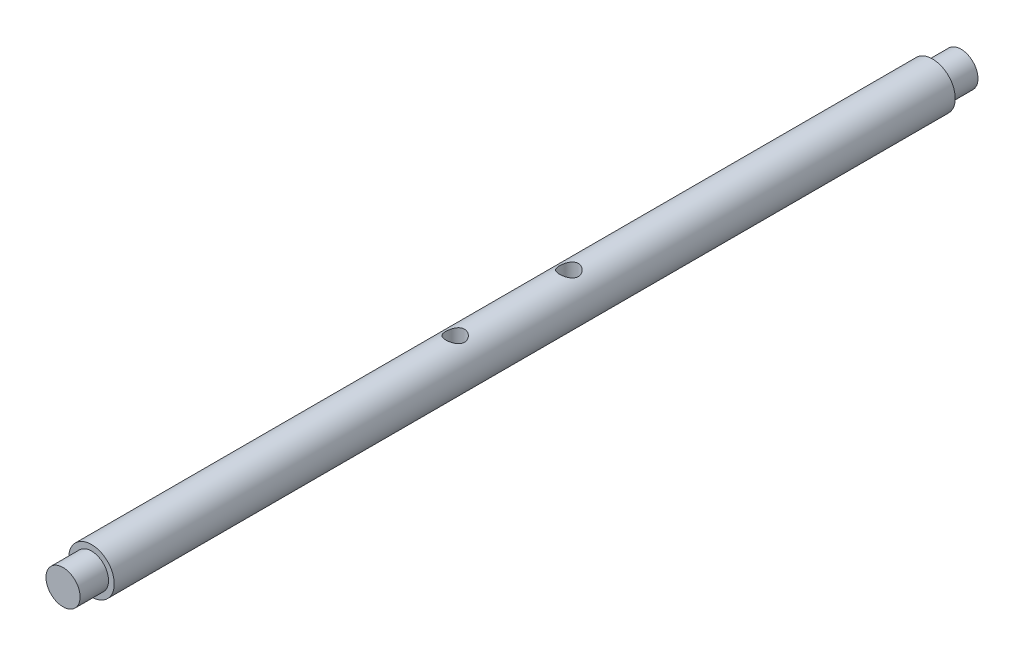
ISO-10303-21;
HEADER;
FILE_DESCRIPTION(('STEP AP214'),'2;1');
FILE_NAME('part.step','',(''),(''),'','','');
FILE_SCHEMA(('AUTOMOTIVE_DESIGN { 1 0 10303 214 1 1 1 1 }'));
ENDSEC;
DATA;
#1=APPLICATION_CONTEXT('core data for automotive mechanical design processes');
#2=APPLICATION_PROTOCOL_DEFINITION('international standard','automotive_design',2000,#1);
#3=PRODUCT_CONTEXT('',#1,'mechanical');
#4=PRODUCT('Part','Part','',(#3));
#5=PRODUCT_RELATED_PRODUCT_CATEGORY('part','',(#4));
#6=PRODUCT_DEFINITION_FORMATION('','',#4);
#7=PRODUCT_DEFINITION_CONTEXT('part definition',#1,'design');
#8=PRODUCT_DEFINITION('design','',#6,#7);
#9=PRODUCT_DEFINITION_SHAPE('','',#8);
#10=(LENGTH_UNIT() NAMED_UNIT(*) SI_UNIT(.MILLI.,.METRE.));
#11=(NAMED_UNIT(*) PLANE_ANGLE_UNIT() SI_UNIT($,.RADIAN.));
#12=(NAMED_UNIT(*) SI_UNIT($,.STERADIAN.) SOLID_ANGLE_UNIT());
#13=UNCERTAINTY_MEASURE_WITH_UNIT(LENGTH_MEASURE(1.E-05),#10,'distance_accuracy_value','');
#14=(GEOMETRIC_REPRESENTATION_CONTEXT(3) GLOBAL_UNCERTAINTY_ASSIGNED_CONTEXT((#13)) GLOBAL_UNIT_ASSIGNED_CONTEXT((#10,
#11,#12)) REPRESENTATION_CONTEXT('',''));
#15=CARTESIAN_POINT('',(0.,0.,0.));
#16=DIRECTION('',(0.,0.,1.));
#17=DIRECTION('',(1.,0.,0.));
#18=AXIS2_PLACEMENT_3D('',#15,#16,#17);
#19=CARTESIAN_POINT('',(0.,0.,147.8));
#20=DIRECTION('',(0.,0.,-1.));
#21=DIRECTION('',(-1.,0.,0.));
#22=AXIS2_PLACEMENT_3D('',#19,#20,#21);
#23=CYLINDRICAL_SURFACE('',#22,4.);
#24=CARTESIAN_POINT('',(0.,-4.,65.55));
#25=CARTESIAN_POINT('',(0.0884596783632864,-3.99999309817074,65.5499907827934));
#26=CARTESIAN_POINT('',(0.177062252057589,-3.99703145792172,65.5428439856567));
#27=CARTESIAN_POINT('',(0.351759669836416,-3.9854711320255,65.5145088580631));
#28=CARTESIAN_POINT('',(0.437847271996969,-3.97685757767606,65.4932834889757));
#29=CARTESIAN_POINT('',(0.604702496902748,-3.95491965529936,65.4377051877981));
#30=CARTESIAN_POINT('',(0.685486934491201,-3.94161112398211,65.4033963566466));
#31=CARTESIAN_POINT('',(0.840076633223493,-3.91158286286531,65.3228052421506));
#32=CARTESIAN_POINT('',(0.913884076117576,-3.89486420463244,65.2765267188299));
#33=CARTESIAN_POINT('',(1.05618769598526,-3.85876900012149,65.170893245356));
#34=CARTESIAN_POINT('',(1.12429373957476,-3.83930654387258,65.111042329751));
#35=CARTESIAN_POINT('',(1.24983574384757,-3.80029483347098,64.9810111603411));
#36=CARTESIAN_POINT('',(1.30726618926958,-3.78074553976622,64.9108256007882));
#37=CARTESIAN_POINT('',(1.4125482680905,-3.74272551686066,64.7580317511283));
#38=CARTESIAN_POINT('',(1.45980781790562,-3.72435159658092,64.6749888846935));
#39=CARTESIAN_POINT('',(1.53951358199408,-3.69212136090386,64.5012636907098));
#40=CARTESIAN_POINT('',(1.57196727712792,-3.67826276509114,64.410585248637));
#41=CARTESIAN_POINT('',(1.61953738222493,-3.65756021871622,64.2286520029982));
#42=CARTESIAN_POINT('',(1.63540371417154,-3.65041449103236,64.137628927857));
#43=CARTESIAN_POINT('',(1.65168918120804,-3.64307714795702,63.9539534926347));
#44=CARTESIAN_POINT('',(1.65211659474001,-3.64288180572738,63.8613020323707));
#45=CARTESIAN_POINT('',(1.63807780779831,-3.64921138579604,63.6844011133813));
#46=CARTESIAN_POINT('',(1.62472398487459,-3.6552343974104,63.6000418412509));
#47=CARTESIAN_POINT('',(1.58536484231199,-3.67247532251837,63.4348897156188));
#48=CARTESIAN_POINT('',(1.55935715587186,-3.68369420783859,63.3540975323967));
#49=CARTESIAN_POINT('',(1.4949241294249,-3.7103145848143,63.1963548912414));
#50=CARTESIAN_POINT('',(1.45624866973018,-3.72579923184191,63.1195212621917));
#51=CARTESIAN_POINT('',(1.36775445443625,-3.75918616236906,62.97313976754));
#52=CARTESIAN_POINT('',(1.3179313547816,-3.77708938726885,62.9035947577509));
#53=CARTESIAN_POINT('',(1.2037191192487,-3.81509742396095,62.7677135922122));
#54=CARTESIAN_POINT('',(1.13846630094389,-3.8352618825369,62.7021180422968));
#55=CARTESIAN_POINT('',(0.997682554866221,-3.87426910607353,62.5825553255586));
#56=CARTESIAN_POINT('',(0.922149319847441,-3.89311157289529,62.5285907761392));
#57=CARTESIAN_POINT('',(0.760736369737334,-3.92787932271737,62.432765226415));
#58=CARTESIAN_POINT('',(0.674664094072245,-3.94373050716791,62.3911997168058));
#59=CARTESIAN_POINT('',(0.495928253552984,-3.97016319816605,62.3233969758911));
#60=CARTESIAN_POINT('',(0.403268287372393,-3.98074755693754,62.2971514467888));
#61=CARTESIAN_POINT('',(0.220181304317681,-3.99492450637935,62.2622704963218));
#62=CARTESIAN_POINT('',(0.12997417230823,-3.99891121146315,62.2526408220641));
#63=CARTESIAN_POINT('',(-0.0508474401522137,-4.00069746426785,62.2483079562367));
#64=CARTESIAN_POINT('',(-0.141461799500558,-3.99849874371343,62.2536005868918));
#65=CARTESIAN_POINT('',(-0.31590775548754,-3.98841747083847,62.278245268243));
#66=CARTESIAN_POINT('',(-0.399855317526676,-3.9808153168881,62.2969040733401));
#67=CARTESIAN_POINT('',(-0.563340473329567,-3.96098887803091,62.3467920963371));
#68=CARTESIAN_POINT('',(-0.642877505872138,-3.94876400644332,62.3780229098148));
#69=CARTESIAN_POINT('',(-0.798061975964468,-3.92039728883464,62.4531893799809));
#70=CARTESIAN_POINT('',(-0.873512656660499,-3.90414585630856,62.4974885617562));
#71=CARTESIAN_POINT('',(-1.01617847320907,-3.86946768187548,62.5971339342579));
#72=CARTESIAN_POINT('',(-1.0833901834211,-3.85104004134398,62.6524846950899));
#73=CARTESIAN_POINT('',(-1.21261994292741,-3.8124029584454,62.777204304812));
#74=CARTESIAN_POINT('',(-1.27394364561821,-3.79215916493832,62.8472838240393));
#75=CARTESIAN_POINT('',(-1.38414835482504,-3.75333928940831,62.9970712906085));
#76=CARTESIAN_POINT('',(-1.43302674162726,-3.73476355904109,63.0767812599426));
#77=CARTESIAN_POINT('',(-1.51742282291386,-3.70128700339843,63.2450953705333));
#78=CARTESIAN_POINT('',(-1.55275802936533,-3.68643724424496,63.3338019160081));
#79=CARTESIAN_POINT('',(-1.60769618165392,-3.66281640168182,63.5167091659782));
#80=CARTESIAN_POINT('',(-1.62731175174752,-3.65404044124936,63.6109053964182));
#81=CARTESIAN_POINT('',(-1.64901123940267,-3.64429559365239,63.7944302731581));
#82=CARTESIAN_POINT('',(-1.65231049364124,-3.64278573581524,63.8835872194579));
#83=CARTESIAN_POINT('',(-1.64451485356566,-3.64631178238904,64.0611284707592));
#84=CARTESIAN_POINT('',(-1.63342206561729,-3.65134672892697,64.1495128869194));
#85=CARTESIAN_POINT('',(-1.59817118006571,-3.666904904187,64.3189330712577));
#86=CARTESIAN_POINT('',(-1.57461958437453,-3.67717261200251,64.4001207114221));
#87=CARTESIAN_POINT('',(-1.51570599472926,-3.70184411206584,64.5574145224741));
#88=CARTESIAN_POINT('',(-1.48034069596891,-3.71624906152171,64.6335192642976));
#89=CARTESIAN_POINT('',(-1.39638062253789,-3.74863408895161,64.7834220382414));
#90=CARTESIAN_POINT('',(-1.3471244359927,-3.76677577854003,64.8568140710214));
#91=CARTESIAN_POINT('',(-1.23771718137822,-3.8041286463671,64.9946716872643));
#92=CARTESIAN_POINT('',(-1.17756245772961,-3.82334018195057,65.0591342627744));
#93=CARTESIAN_POINT('',(-1.04300738755742,-3.86230172013188,65.1819941387037));
#94=CARTESIAN_POINT('',(-0.967900110730158,-3.88199359359226,65.2396392236055));
#95=CARTESIAN_POINT('',(-0.808343463182015,-3.9183242690558,65.3415401595387));
#96=CARTESIAN_POINT('',(-0.723889843442837,-3.9349616732268,65.3857898863659));
#97=CARTESIAN_POINT('',(-0.549414760109621,-3.96305691394126,65.4586637398348));
#98=CARTESIAN_POINT('',(-0.459513381649419,-3.97459855421812,65.4875424253586));
#99=CARTESIAN_POINT('',(-0.275719229213236,-3.99154438775475,65.5295110847852));
#100=CARTESIAN_POINT('',(-0.181839966818023,-3.99696786149576,65.5426506662454));
#101=CARTESIAN_POINT('',(-0.0584442952271896,-3.99968194626838,65.5492267703301));
#102=CARTESIAN_POINT('',(-0.0292299486703303,-4.00000228058838,65.5500030456642));
#103=CARTESIAN_POINT('',(0.,-4.,65.55));
#104=B_SPLINE_CURVE_WITH_KNOTS('',3,(#24,#25,#26,#27,#28,#29,#30,#31,#32,#33,#34,#35,#36,#37,
#38,#39,#40,#41,#42,#43,#44,#45,#46,#47,#48,#49,#50,#51,#52,#53,#54,#55,#56,#57,#58,#59,#60,#61,
#62,#63,#64,#65,#66,#67,#68,#69,#70,#71,#72,#73,#74,#75,#76,#77,#78,#79,#80,#81,#82,#83,#84,#85,
#86,#87,#88,#89,#90,#91,#92,#93,#94,#95,#96,#97,#98,#99,#100,#101,#102,#103),.UNSPECIFIED.,.T.,
.F.,(4,2,2,2,2,2,2,2,2,2,2,2,2,2,2,2,2,2,2,2,2,2,2,2,2,2,2,2,2,2,2,2,2,2,2,2,2,2,2,4),(0.,
0.265297098770617,0.531294937906661,0.796403981498879,1.06142984766523,1.33841878994455,
1.61555043582129,1.90598404924538,2.19627075414926,2.47277648539421,2.74913395037961,
3.00480633611684,3.26052656166861,3.52163539301341,3.78284615202016,4.06565185095456,
4.3485211252851,4.63767392136376,4.92666995726768,5.19768149557686,5.46861716672806,
5.72643264660554,5.98428085748385,6.25011488704507,6.51605907418433,6.80064580250403,
7.08529238632159,7.37364985225781,7.66177550895675,7.92807823226724,8.19434198489785,
8.44869772098561,8.70312467109947,8.9726747998471,9.24231550885214,9.53104085816544,
9.81989801073179,10.1038095613048,10.3868238858899,10.4744866574818),.UNSPECIFIED.);
#105=CARTESIAN_POINT('',(0.,-4.,65.55));
#106=VERTEX_POINT('',#105);
#107=EDGE_CURVE('E10',#106,#106,#104,.T.);
#108=ORIENTED_EDGE('',*,*,#107,.T.);
#109=EDGE_LOOP('',(#108));
#110=FACE_BOUND('',#109,.T.);
#111=CARTESIAN_POINT('',(0.,4.,65.55));
#112=CARTESIAN_POINT('',(-0.0884596783632689,3.99999309817074,65.5499907827934));
#113=CARTESIAN_POINT('',(-0.177062252057572,3.99703145792172,65.5428439856567));
#114=CARTESIAN_POINT('',(-0.351759669836399,3.9854711320255,65.5145088580631));
#115=CARTESIAN_POINT('',(-0.437847271996951,3.97685757767607,65.4932834889757));
#116=CARTESIAN_POINT('',(-0.60470249690273,3.95491965529936,65.4377051877981));
#117=CARTESIAN_POINT('',(-0.685486934491183,3.94161112398211,65.4033963566466));
#118=CARTESIAN_POINT('',(-0.840076633223476,3.91158286286531,65.3228052421506));
#119=CARTESIAN_POINT('',(-0.913884076117558,3.89486420463245,65.2765267188299));
#120=CARTESIAN_POINT('',(-1.05618769598524,3.85876900012149,65.170893245356));
#121=CARTESIAN_POINT('',(-1.12429373957475,3.83930654387259,65.111042329751));
#122=CARTESIAN_POINT('',(-1.24983574384755,3.80029483347099,64.9810111603411));
#123=CARTESIAN_POINT('',(-1.30726618926956,3.78074553976623,64.9108256007882));
#124=CARTESIAN_POINT('',(-1.41254826809049,3.74272551686067,64.7580317511283));
#125=CARTESIAN_POINT('',(-1.4598078179056,3.72435159658093,64.6749888846935));
#126=CARTESIAN_POINT('',(-1.53951358199406,3.69212136090387,64.5012636907098));
#127=CARTESIAN_POINT('',(-1.5719672771279,3.67826276509115,64.410585248637));
#128=CARTESIAN_POINT('',(-1.61953738222491,3.65756021871623,64.2286520029982));
#129=CARTESIAN_POINT('',(-1.63540371417153,3.65041449103237,64.137628927857));
#130=CARTESIAN_POINT('',(-1.65168918120802,3.64307714795703,63.9539534926347));
#131=CARTESIAN_POINT('',(-1.65211659473999,3.64288180572738,63.8613020323707));
#132=CARTESIAN_POINT('',(-1.63807780779829,3.64921138579605,63.6844011133813));
#133=CARTESIAN_POINT('',(-1.62472398487458,3.65523439741041,63.6000418412509));
#134=CARTESIAN_POINT('',(-1.58536484231197,3.67247532251837,63.4348897156188));
#135=CARTESIAN_POINT('',(-1.55935715587184,3.68369420783859,63.3540975323967));
#136=CARTESIAN_POINT('',(-1.49492412942488,3.71031458481431,63.1963548912414));
#137=CARTESIAN_POINT('',(-1.45624866973016,3.72579923184192,63.1195212621917));
#138=CARTESIAN_POINT('',(-1.36775445443624,3.75918616236907,62.97313976754));
#139=CARTESIAN_POINT('',(-1.31793135478158,3.77708938726885,62.9035947577509));
#140=CARTESIAN_POINT('',(-1.20371911924868,3.81509742396095,62.7677135922122));
#141=CARTESIAN_POINT('',(-1.13846630094387,3.8352618825369,62.7021180422968));
#142=CARTESIAN_POINT('',(-0.997682554866204,3.87426910607353,62.5825553255586));
#143=CARTESIAN_POINT('',(-0.922149319847424,3.8931115728953,62.5285907761392));
#144=CARTESIAN_POINT('',(-0.760736369737316,3.92787932271737,62.432765226415));
#145=CARTESIAN_POINT('',(-0.674664094072227,3.94373050716791,62.3911997168058));
#146=CARTESIAN_POINT('',(-0.495928253552967,3.97016319816606,62.3233969758911));
#147=CARTESIAN_POINT('',(-0.403268287372376,3.98074755693754,62.2971514467888));
#148=CARTESIAN_POINT('',(-0.220181304317664,3.99492450637935,62.2622704963218));
#149=CARTESIAN_POINT('',(-0.129974172308213,3.99891121146315,62.2526408220641));
#150=CARTESIAN_POINT('',(0.0508474401522308,4.00069746426785,62.2483079562367));
#151=CARTESIAN_POINT('',(0.141461799500574,3.99849874371343,62.2536005868918));
#152=CARTESIAN_POINT('',(0.315907755487557,3.98841747083846,62.278245268243));
#153=CARTESIAN_POINT('',(0.399855317526693,3.9808153168881,62.2969040733401));
#154=CARTESIAN_POINT('',(0.563340473329583,3.96098887803091,62.3467920963371));
#155=CARTESIAN_POINT('',(0.642877505872155,3.94876400644332,62.3780229098148));
#156=CARTESIAN_POINT('',(0.798061975964484,3.92039728883464,62.4531893799809));
#157=CARTESIAN_POINT('',(0.873512656660517,3.90414585630856,62.4974885617562));
#158=CARTESIAN_POINT('',(1.01617847320908,3.86946768187548,62.5971339342579));
#159=CARTESIAN_POINT('',(1.08339018342112,3.85104004134398,62.6524846950899));
#160=CARTESIAN_POINT('',(1.21261994292742,3.8124029584454,62.777204304812));
#161=CARTESIAN_POINT('',(1.27394364561823,3.79215916493832,62.8472838240393));
#162=CARTESIAN_POINT('',(1.38414835482506,3.7533392894083,62.9970712906085));
#163=CARTESIAN_POINT('',(1.43302674162728,3.73476355904109,63.0767812599426));
#164=CARTESIAN_POINT('',(1.51742282291388,3.70128700339843,63.2450953705333));
#165=CARTESIAN_POINT('',(1.55275802936535,3.68643724424496,63.3338019160081));
#166=CARTESIAN_POINT('',(1.60769618165394,3.66281640168181,63.5167091659782));
#167=CARTESIAN_POINT('',(1.62731175174754,3.65404044124935,63.6109053964182));
#168=CARTESIAN_POINT('',(1.64901123940269,3.64429559365239,63.7944302731581));
#169=CARTESIAN_POINT('',(1.65231049364126,3.64278573581523,63.8835872194579));
#170=CARTESIAN_POINT('',(1.64451485356568,3.64631178238903,64.0611284707592));
#171=CARTESIAN_POINT('',(1.63342206561731,3.65134672892696,64.1495128869194));
#172=CARTESIAN_POINT('',(1.59817118006573,3.66690490418699,64.3189330712577));
#173=CARTESIAN_POINT('',(1.57461958437455,3.6771726120025,64.4001207114221));
#174=CARTESIAN_POINT('',(1.51570599472928,3.70184411206583,64.5574145224741));
#175=CARTESIAN_POINT('',(1.48034069596894,3.7162490615217,64.6335192642976));
#176=CARTESIAN_POINT('',(1.39638062253791,3.7486340889516,64.7834220382414));
#177=CARTESIAN_POINT('',(1.34712443599272,3.76677577854002,64.8568140710214));
#178=CARTESIAN_POINT('',(1.23771718137823,3.80412864636709,64.9946716872643));
#179=CARTESIAN_POINT('',(1.17756245772963,3.82334018195056,65.0591342627744));
#180=CARTESIAN_POINT('',(1.04300738755744,3.86230172013188,65.1819941387037));
#181=CARTESIAN_POINT('',(0.967900110730185,3.88199359359226,65.2396392236056));
#182=CARTESIAN_POINT('',(0.808343463182043,3.91832426905579,65.3415401595387));
#183=CARTESIAN_POINT('',(0.723889843442858,3.9349616732268,65.3857898863659));
#184=CARTESIAN_POINT('',(0.549414760109637,3.96305691394126,65.4586637398347));
#185=CARTESIAN_POINT('',(0.459513381649437,3.97459855421812,65.4875424253586));
#186=CARTESIAN_POINT('',(0.275719229213254,3.99154438775475,65.5295110847852));
#187=CARTESIAN_POINT('',(0.18183996681804,3.99696786149576,65.5426506662454));
#188=CARTESIAN_POINT('',(0.0584442952272064,3.99968194626838,65.5492267703301));
#189=CARTESIAN_POINT('',(0.0292299486703474,4.00000228058838,65.5500030456642));
#190=CARTESIAN_POINT('',(0.,4.,65.55));
#191=B_SPLINE_CURVE_WITH_KNOTS('',3,(#111,#112,#113,#114,#115,#116,#117,#118,#119,#120,#121,
#122,#123,#124,#125,#126,#127,#128,#129,#130,#131,#132,#133,#134,#135,#136,#137,#138,#139,#140,
#141,#142,#143,#144,#145,#146,#147,#148,#149,#150,#151,#152,#153,#154,#155,#156,#157,#158,#159,
#160,#161,#162,#163,#164,#165,#166,#167,#168,#169,#170,#171,#172,#173,#174,#175,#176,#177,#178,
#179,#180,#181,#182,#183,#184,#185,#186,#187,#188,#189,#190),.UNSPECIFIED.,.T.,.F.,(4,2,2,2,2,2,
2,2,2,2,2,2,2,2,2,2,2,2,2,2,2,2,2,2,2,2,2,2,2,2,2,2,2,2,2,2,2,2,2,4),(0.,0.265297098770616,
0.531294937906661,0.796403981498878,1.06142984766523,1.33841878994455,1.61555043582129,
1.90598404924538,2.19627075414925,2.47277648539421,2.7491339503796,3.00480633611684,
3.26052656166861,3.52163539301341,3.78284615202016,4.06565185095456,4.34852112528509,
4.63767392136376,4.92666995726768,5.19768149557686,5.46861716672805,5.72643264660554,
5.98428085748385,6.25011488704507,6.51605907418433,6.80064580250403,7.08529238632159,
7.37364985225781,7.66177550895675,7.92807823226724,8.19434198489785,8.44869772098559,
8.70312467109945,8.97267479984709,9.24231550885213,9.53104085816543,9.81989801073179,
10.1038095613048,10.3868238858899,10.4744866574818),.UNSPECIFIED.);
#192=CARTESIAN_POINT('',(0.,4.,65.55));
#193=VERTEX_POINT('',#192);
#194=EDGE_CURVE('E42',#193,#193,#191,.T.);
#195=ORIENTED_EDGE('',*,*,#194,.T.);
#196=EDGE_LOOP('',(#195));
#197=FACE_BOUND('',#196,.T.);
#198=CARTESIAN_POINT('',(0.,-4.,85.55));
#199=CARTESIAN_POINT('',(0.0884596783632888,-3.99999309817074,85.5499907827934));
#200=CARTESIAN_POINT('',(0.177062252057592,-3.99703145792172,85.5428439856567));
#201=CARTESIAN_POINT('',(0.351759669836419,-3.9854711320255,85.5145088580631));
#202=CARTESIAN_POINT('',(0.437847271996972,-3.97685757767606,85.4932834889757));
#203=CARTESIAN_POINT('',(0.604702496902751,-3.95491965529935,85.4377051877981));
#204=CARTESIAN_POINT('',(0.685486934491204,-3.94161112398211,85.4033963566465));
#205=CARTESIAN_POINT('',(0.840076633223496,-3.91158286286531,85.3228052421506));
#206=CARTESIAN_POINT('',(0.913884076117578,-3.89486420463244,85.2765267188298));
#207=CARTESIAN_POINT('',(1.05618769598526,-3.85876900012149,85.170893245356));
#208=CARTESIAN_POINT('',(1.12429373957477,-3.83930654387258,85.111042329751));
#209=CARTESIAN_POINT('',(1.24983574384757,-3.80029483347098,84.981011160341));
#210=CARTESIAN_POINT('',(1.30726618926958,-3.78074553976622,84.9108256007882));
#211=CARTESIAN_POINT('',(1.41254826809051,-3.74272551686066,84.7580317511283));
#212=CARTESIAN_POINT('',(1.45980781790562,-3.72435159658092,84.6749888846935));
#213=CARTESIAN_POINT('',(1.53951358199408,-3.69212136090386,84.5012636907098));
#214=CARTESIAN_POINT('',(1.57196727712792,-3.67826276509114,84.410585248637));
#215=CARTESIAN_POINT('',(1.61953738222493,-3.65756021871622,84.2286520029982));
#216=CARTESIAN_POINT('',(1.63540371417155,-3.65041449103236,84.1376289278569));
#217=CARTESIAN_POINT('',(1.65168918120804,-3.64307714795702,83.9539534926347));
#218=CARTESIAN_POINT('',(1.65211659474001,-3.64288180572737,83.8613020323707));
#219=CARTESIAN_POINT('',(1.63807780779831,-3.64921138579604,83.6844011133813));
#220=CARTESIAN_POINT('',(1.6247239848746,-3.6552343974104,83.6000418412508));
#221=CARTESIAN_POINT('',(1.58536484231199,-3.67247532251837,83.4348897156188));
#222=CARTESIAN_POINT('',(1.55935715587186,-3.68369420783859,83.3540975323967));
#223=CARTESIAN_POINT('',(1.4949241294249,-3.7103145848143,83.1963548912414));
#224=CARTESIAN_POINT('',(1.45624866973018,-3.72579923184191,83.1195212621917));
#225=CARTESIAN_POINT('',(1.36775445443625,-3.75918616236906,82.97313976754));
#226=CARTESIAN_POINT('',(1.3179313547816,-3.77708938726885,82.9035947577509));
#227=CARTESIAN_POINT('',(1.2037191192487,-3.81509742396094,82.7677135922122));
#228=CARTESIAN_POINT('',(1.13846630094389,-3.8352618825369,82.7021180422967));
#229=CARTESIAN_POINT('',(0.997682554866227,-3.87426910607353,82.5825553255586));
#230=CARTESIAN_POINT('',(0.92214931984745,-3.89311157289529,82.5285907761392));
#231=CARTESIAN_POINT('',(0.760736369737341,-3.92787932271737,82.432765226415));
#232=CARTESIAN_POINT('',(0.674664094072248,-3.94373050716791,82.3911997168058));
#233=CARTESIAN_POINT('',(0.495928253552985,-3.97016319816605,82.3233969758911));
#234=CARTESIAN_POINT('',(0.403268287372394,-3.98074755693754,82.2971514467888));
#235=CARTESIAN_POINT('',(0.220181304317683,-3.99492450637935,82.2622704963218));
#236=CARTESIAN_POINT('',(0.129974172308231,-3.99891121146315,82.2526408220641));
#237=CARTESIAN_POINT('',(-0.0508474401522126,-4.00069746426785,82.2483079562367));
#238=CARTESIAN_POINT('',(-0.141461799500556,-3.99849874371343,82.2536005868918));
#239=CARTESIAN_POINT('',(-0.31590775548754,-3.98841747083847,82.278245268243));
#240=CARTESIAN_POINT('',(-0.399855317526679,-3.9808153168881,82.2969040733401));
#241=CARTESIAN_POINT('',(-0.563340473329569,-3.96098887803091,82.3467920963371));
#242=CARTESIAN_POINT('',(-0.642877505872137,-3.94876400644332,82.3780229098148));
#243=CARTESIAN_POINT('',(-0.798061975964464,-3.92039728883464,82.4531893799809));
#244=CARTESIAN_POINT('',(-0.873512656660496,-3.90414585630856,82.4974885617562));
#245=CARTESIAN_POINT('',(-1.01617847320906,-3.86946768187548,82.5971339342579));
#246=CARTESIAN_POINT('',(-1.0833901834211,-3.85104004134398,82.6524846950898));
#247=CARTESIAN_POINT('',(-1.2126199429274,-3.8124029584454,82.777204304812));
#248=CARTESIAN_POINT('',(-1.27394364561821,-3.79215916493832,82.8472838240393));
#249=CARTESIAN_POINT('',(-1.38414835482504,-3.75333928940831,82.9970712906085));
#250=CARTESIAN_POINT('',(-1.43302674162726,-3.73476355904109,83.0767812599425));
#251=CARTESIAN_POINT('',(-1.51742282291386,-3.70128700339844,83.2450953705333));
#252=CARTESIAN_POINT('',(-1.55275802936533,-3.68643724424497,83.3338019160081));
#253=CARTESIAN_POINT('',(-1.60769618165392,-3.66281640168182,83.5167091659782));
#254=CARTESIAN_POINT('',(-1.62731175174752,-3.65404044124936,83.6109053964182));
#255=CARTESIAN_POINT('',(-1.64901123940267,-3.6442955936524,83.7944302731581));
#256=CARTESIAN_POINT('',(-1.65231049364124,-3.64278573581524,83.8835872194579));
#257=CARTESIAN_POINT('',(-1.64451485356566,-3.64631178238904,84.0611284707592));
#258=CARTESIAN_POINT('',(-1.63342206561729,-3.65134672892697,84.1495128869194));
#259=CARTESIAN_POINT('',(-1.59817118006571,-3.666904904187,84.3189330712577));
#260=CARTESIAN_POINT('',(-1.57461958437453,-3.67717261200251,84.4001207114221));
#261=CARTESIAN_POINT('',(-1.51570599472926,-3.70184411206584,84.5574145224741));
#262=CARTESIAN_POINT('',(-1.48034069596891,-3.71624906152171,84.6335192642976));
#263=CARTESIAN_POINT('',(-1.39638062253789,-3.74863408895161,84.7834220382414));
#264=CARTESIAN_POINT('',(-1.3471244359927,-3.76677577854003,84.8568140710214));
#265=CARTESIAN_POINT('',(-1.23771718137821,-3.8041286463671,84.9946716872643));
#266=CARTESIAN_POINT('',(-1.17756245772961,-3.82334018195057,85.0591342627744));
#267=CARTESIAN_POINT('',(-1.04300738755742,-3.86230172013188,85.1819941387037));
#268=CARTESIAN_POINT('',(-0.967900110730167,-3.88199359359226,85.2396392236055));
#269=CARTESIAN_POINT('',(-0.808343463182024,-3.91832426905579,85.3415401595387));
#270=CARTESIAN_POINT('',(-0.723889843442839,-3.9349616732268,85.3857898863659));
#271=CARTESIAN_POINT('',(-0.549414760109617,-3.96305691394126,85.4586637398347));
#272=CARTESIAN_POINT('',(-0.459513381649417,-3.97459855421812,85.4875424253586));
#273=CARTESIAN_POINT('',(-0.275719229213233,-3.99154438775475,85.5295110847852));
#274=CARTESIAN_POINT('',(-0.181839966818019,-3.99696786149576,85.5426506662454));
#275=CARTESIAN_POINT('',(-0.058444295227185,-3.99968194626838,85.54922677033));
#276=CARTESIAN_POINT('',(-0.0292299486703268,-4.00000228058838,85.5500030456642));
#277=CARTESIAN_POINT('',(0.,-4.,85.55));
#278=B_SPLINE_CURVE_WITH_KNOTS('',3,(#198,#199,#200,#201,#202,#203,#204,#205,#206,#207,#208,
#209,#210,#211,#212,#213,#214,#215,#216,#217,#218,#219,#220,#221,#222,#223,#224,#225,#226,#227,
#228,#229,#230,#231,#232,#233,#234,#235,#236,#237,#238,#239,#240,#241,#242,#243,#244,#245,#246,
#247,#248,#249,#250,#251,#252,#253,#254,#255,#256,#257,#258,#259,#260,#261,#262,#263,#264,#265,
#266,#267,#268,#269,#270,#271,#272,#273,#274,#275,#276,#277),.UNSPECIFIED.,.T.,.F.,(4,2,2,2,2,2,
2,2,2,2,2,2,2,2,2,2,2,2,2,2,2,2,2,2,2,2,2,2,2,2,2,2,2,2,2,2,2,2,2,4),(0.,0.265297098770617,
0.531294937906662,0.796403981498879,1.06142984766523,1.33841878994455,1.61555043582129,
1.90598404924538,2.19627075414926,2.47277648539421,2.74913395037961,3.00480633611684,
3.26052656166861,3.52163539301341,3.78284615202016,4.06565185095456,4.34852112528509,
4.63767392136377,4.92666995726769,5.19768149557687,5.46861716672806,5.72643264660555,
5.98428085748385,6.25011488704507,6.51605907418433,6.80064580250404,7.08529238632159,
7.37364985225781,7.66177550895675,7.92807823226723,8.19434198489786,8.44869772098561,
8.70312467109947,8.9726747998471,9.24231550885214,9.53104085816542,9.81989801073179,
10.1038095613048,10.3868238858899,10.4744866574818),.UNSPECIFIED.);
#279=CARTESIAN_POINT('',(0.,-4.,85.55));
#280=VERTEX_POINT('',#279);
#281=EDGE_CURVE('E46',#280,#280,#278,.T.);
#282=ORIENTED_EDGE('',*,*,#281,.T.);
#283=EDGE_LOOP('',(#282));
#284=FACE_BOUND('',#283,.T.);
#285=CARTESIAN_POINT('',(0.,4.,85.55));
#286=CARTESIAN_POINT('',(-0.0884596783632664,3.99999309817074,85.5499907827934));
#287=CARTESIAN_POINT('',(-0.177062252057569,3.99703145792172,85.5428439856567));
#288=CARTESIAN_POINT('',(-0.351759669836396,3.9854711320255,85.5145088580631));
#289=CARTESIAN_POINT('',(-0.437847271996949,3.97685757767607,85.4932834889757));
#290=CARTESIAN_POINT('',(-0.604702496902728,3.95491965529936,85.4377051877981));
#291=CARTESIAN_POINT('',(-0.685486934491181,3.94161112398211,85.4033963566465));
#292=CARTESIAN_POINT('',(-0.840076633223473,3.91158286286531,85.3228052421506));
#293=CARTESIAN_POINT('',(-0.913884076117556,3.89486420463245,85.2765267188298));
#294=CARTESIAN_POINT('',(-1.05618769598524,3.85876900012149,85.170893245356));
#295=CARTESIAN_POINT('',(-1.12429373957474,3.83930654387259,85.111042329751));
#296=CARTESIAN_POINT('',(-1.24983574384755,3.80029483347099,84.981011160341));
#297=CARTESIAN_POINT('',(-1.30726618926956,3.78074553976623,84.9108256007882));
#298=CARTESIAN_POINT('',(-1.41254826809048,3.74272551686067,84.7580317511283));
#299=CARTESIAN_POINT('',(-1.4598078179056,3.72435159658093,84.6749888846935));
#300=CARTESIAN_POINT('',(-1.53951358199406,3.69212136090387,84.5012636907098));
#301=CARTESIAN_POINT('',(-1.5719672771279,3.67826276509115,84.410585248637));
#302=CARTESIAN_POINT('',(-1.61953738222491,3.65756021871623,84.2286520029982));
#303=CARTESIAN_POINT('',(-1.63540371417152,3.65041449103237,84.1376289278569));
#304=CARTESIAN_POINT('',(-1.65168918120802,3.64307714795703,83.9539534926347));
#305=CARTESIAN_POINT('',(-1.65211659473999,3.64288180572738,83.8613020323707));
#306=CARTESIAN_POINT('',(-1.63807780779829,3.64921138579605,83.6844011133813));
#307=CARTESIAN_POINT('',(-1.62472398487457,3.65523439741041,83.6000418412508));
#308=CARTESIAN_POINT('',(-1.58536484231197,3.67247532251838,83.4348897156188));
#309=CARTESIAN_POINT('',(-1.55935715587184,3.68369420783859,83.3540975323967));
#310=CARTESIAN_POINT('',(-1.49492412942488,3.71031458481431,83.1963548912414));
#311=CARTESIAN_POINT('',(-1.45624866973016,3.72579923184192,83.1195212621917));
#312=CARTESIAN_POINT('',(-1.36775445443623,3.75918616236907,82.97313976754));
#313=CARTESIAN_POINT('',(-1.31793135478158,3.77708938726886,82.9035947577509));
#314=CARTESIAN_POINT('',(-1.20371911924868,3.81509742396095,82.7677135922122));
#315=CARTESIAN_POINT('',(-1.13846630094387,3.8352618825369,82.7021180422967));
#316=CARTESIAN_POINT('',(-0.997682554866205,3.87426910607353,82.5825553255586));
#317=CARTESIAN_POINT('',(-0.922149319847427,3.8931115728953,82.5285907761392));
#318=CARTESIAN_POINT('',(-0.760736369737319,3.92787932271737,82.432765226415));
#319=CARTESIAN_POINT('',(-0.674664094072225,3.94373050716791,82.3911997168058));
#320=CARTESIAN_POINT('',(-0.495928253552962,3.97016319816606,82.3233969758911));
#321=CARTESIAN_POINT('',(-0.403268287372371,3.98074755693754,82.2971514467888));
#322=CARTESIAN_POINT('',(-0.22018130431766,3.99492450637935,82.2622704963218));
#323=CARTESIAN_POINT('',(-0.129974172308208,3.99891121146315,82.2526408220641));
#324=CARTESIAN_POINT('',(0.0508474401522356,4.00069746426785,82.2483079562367));
#325=CARTESIAN_POINT('',(0.141461799500579,3.99849874371343,82.2536005868918));
#326=CARTESIAN_POINT('',(0.315907755487562,3.98841747083846,82.278245268243));
#327=CARTESIAN_POINT('',(0.3998553175267,3.9808153168881,82.2969040733401));
#328=CARTESIAN_POINT('',(0.563340473329589,3.96098887803091,82.3467920963371));
#329=CARTESIAN_POINT('',(0.642877505872158,3.94876400644332,82.3780229098148));
#330=CARTESIAN_POINT('',(0.798061975964486,3.92039728883464,82.4531893799809));
#331=CARTESIAN_POINT('',(0.873512656660519,3.90414585630855,82.4974885617562));
#332=CARTESIAN_POINT('',(1.01617847320909,3.86946768187548,82.5971339342579));
#333=CARTESIAN_POINT('',(1.08339018342112,3.85104004134398,82.6524846950898));
#334=CARTESIAN_POINT('',(1.21261994292743,3.81240295844539,82.777204304812));
#335=CARTESIAN_POINT('',(1.27394364561823,3.79215916493832,82.8472838240393));
#336=CARTESIAN_POINT('',(1.38414835482506,3.7533392894083,82.9970712906085));
#337=CARTESIAN_POINT('',(1.43302674162728,3.73476355904108,83.0767812599425));
#338=CARTESIAN_POINT('',(1.51742282291388,3.70128700339843,83.2450953705333));
#339=CARTESIAN_POINT('',(1.55275802936535,3.68643724424496,83.3338019160081));
#340=CARTESIAN_POINT('',(1.60769618165394,3.66281640168181,83.5167091659782));
#341=CARTESIAN_POINT('',(1.62731175174754,3.65404044124935,83.6109053964182));
#342=CARTESIAN_POINT('',(1.64901123940269,3.64429559365238,83.7944302731581));
#343=CARTESIAN_POINT('',(1.65231049364126,3.64278573581523,83.8835872194579));
#344=CARTESIAN_POINT('',(1.64451485356568,3.64631178238903,84.0611284707592));
#345=CARTESIAN_POINT('',(1.63342206561731,3.65134672892696,84.1495128869194));
#346=CARTESIAN_POINT('',(1.59817118006573,3.66690490418699,84.3189330712577));
#347=CARTESIAN_POINT('',(1.57461958437455,3.6771726120025,84.4001207114221));
#348=CARTESIAN_POINT('',(1.51570599472928,3.70184411206584,84.5574145224741));
#349=CARTESIAN_POINT('',(1.48034069596893,3.7162490615217,84.6335192642976));
#350=CARTESIAN_POINT('',(1.39638062253791,3.7486340889516,84.7834220382414));
#351=CARTESIAN_POINT('',(1.34712443599272,3.76677577854002,84.8568140710214));
#352=CARTESIAN_POINT('',(1.23771718137824,3.80412864636709,84.9946716872643));
#353=CARTESIAN_POINT('',(1.17756245772963,3.82334018195056,85.0591342627744));
#354=CARTESIAN_POINT('',(1.04300738755745,3.86230172013188,85.1819941387037));
#355=CARTESIAN_POINT('',(0.967900110730189,3.88199359359226,85.2396392236055));
#356=CARTESIAN_POINT('',(0.808343463182046,3.91832426905579,85.3415401595387));
#357=CARTESIAN_POINT('',(0.723889843442862,3.93496167322679,85.3857898863659));
#358=CARTESIAN_POINT('',(0.549414760109639,3.96305691394126,85.4586637398347));
#359=CARTESIAN_POINT('',(0.459513381649438,3.97459855421812,85.4875424253586));
#360=CARTESIAN_POINT('',(0.275719229213255,3.99154438775475,85.5295110847852));
#361=CARTESIAN_POINT('',(0.181839966818041,3.99696786149576,85.5426506662454));
#362=CARTESIAN_POINT('',(0.0584442952272073,3.99968194626838,85.54922677033));
#363=CARTESIAN_POINT('',(0.0292299486703491,4.00000228058838,85.5500030456642));
#364=CARTESIAN_POINT('',(0.,4.,85.55));
#365=B_SPLINE_CURVE_WITH_KNOTS('',3,(#285,#286,#287,#288,#289,#290,#291,#292,#293,#294,#295,
#296,#297,#298,#299,#300,#301,#302,#303,#304,#305,#306,#307,#308,#309,#310,#311,#312,#313,#314,
#315,#316,#317,#318,#319,#320,#321,#322,#323,#324,#325,#326,#327,#328,#329,#330,#331,#332,#333,
#334,#335,#336,#337,#338,#339,#340,#341,#342,#343,#344,#345,#346,#347,#348,#349,#350,#351,#352,
#353,#354,#355,#356,#357,#358,#359,#360,#361,#362,#363,#364),.UNSPECIFIED.,.T.,.F.,(4,2,2,2,2,2,
2,2,2,2,2,2,2,2,2,2,2,2,2,2,2,2,2,2,2,2,2,2,2,2,2,2,2,2,2,2,2,2,2,4),(0.,0.265297098770616,
0.531294937906661,0.796403981498878,1.06142984766523,1.33841878994455,1.61555043582129,
1.90598404924538,2.19627075414925,2.47277648539421,2.7491339503796,3.00480633611684,
3.26052656166861,3.52163539301341,3.78284615202016,4.06565185095456,4.34852112528509,
4.63767392136376,4.92666995726768,5.19768149557687,5.46861716672806,5.72643264660555,
5.98428085748385,6.25011488704507,6.51605907418433,6.80064580250403,7.08529238632159,
7.37364985225781,7.66177550895677,7.92807823226724,8.19434198489786,8.44869772098563,
8.70312467109947,8.9726747998471,9.24231550885214,9.53104085816542,9.81989801073179,
10.1038095613048,10.3868238858899,10.4744866574818),.UNSPECIFIED.);
#366=CARTESIAN_POINT('',(0.,4.,85.55));
#367=VERTEX_POINT('',#366);
#368=EDGE_CURVE('E50',#367,#367,#365,.T.);
#369=ORIENTED_EDGE('',*,*,#368,.T.);
#370=EDGE_LOOP('',(#369));
#371=FACE_BOUND('',#370,.T.);
#372=CARTESIAN_POINT('',(0.,0.,147.8));
#373=DIRECTION('',(0.,0.,1.));
#374=DIRECTION('',(1.,0.,0.));
#375=AXIS2_PLACEMENT_3D('',#372,#373,#374);
#376=CIRCLE('',#375,4.);
#377=CARTESIAN_POINT('',(4.,0.,147.8));
#378=VERTEX_POINT('',#377);
#379=EDGE_CURVE('E82',#378,#378,#376,.T.);
#380=ORIENTED_EDGE('',*,*,#379,.F.);
#381=EDGE_LOOP('',(#380));
#382=FACE_BOUND('',#381,.T.);
#383=CARTESIAN_POINT('',(0.,0.,0.));
#384=DIRECTION('',(0.,0.,1.));
#385=DIRECTION('',(1.,0.,0.));
#386=AXIS2_PLACEMENT_3D('',#383,#384,#385);
#387=CIRCLE('',#386,4.);
#388=CARTESIAN_POINT('',(4.,0.,0.));
#389=VERTEX_POINT('',#388);
#390=EDGE_CURVE('E79',#389,#389,#387,.T.);
#391=ORIENTED_EDGE('',*,*,#390,.T.);
#392=EDGE_LOOP('',(#391));
#393=FACE_BOUND('',#392,.T.);
#394=ADVANCED_FACE('F31',(#110,#197,#284,#371,#382,#393),#23,.T.);
#395=CARTESIAN_POINT('',(0.,0.,147.8));
#396=DIRECTION('',(0.,0.,1.));
#397=DIRECTION('',(1.,0.,0.));
#398=AXIS2_PLACEMENT_3D('',#395,#396,#397);
#399=PLANE('',#398);
#400=CARTESIAN_POINT('',(0.,0.,147.8));
#401=DIRECTION('',(0.,0.,1.));
#402=DIRECTION('',(1.,0.,0.));
#403=AXIS2_PLACEMENT_3D('',#400,#401,#402);
#404=CIRCLE('',#403,3.);
#405=CARTESIAN_POINT('',(3.,0.,147.8));
#406=VERTEX_POINT('',#405);
#407=EDGE_CURVE('E78',#406,#406,#404,.T.);
#408=ORIENTED_EDGE('',*,*,#407,.F.);
#409=EDGE_LOOP('',(#408));
#410=FACE_BOUND('',#409,.T.);
#411=ORIENTED_EDGE('',*,*,#379,.T.);
#412=EDGE_LOOP('',(#411));
#413=FACE_BOUND('',#412,.T.);
#414=ADVANCED_FACE('F106',(#410,#413),#399,.T.);
#415=CARTESIAN_POINT('',(0.,0.,0.));
#416=DIRECTION('',(0.,0.,1.));
#417=DIRECTION('',(1.,0.,0.));
#418=AXIS2_PLACEMENT_3D('',#415,#416,#417);
#419=PLANE('',#418);
#420=CARTESIAN_POINT('',(0.,0.,0.));
#421=DIRECTION('',(0.,0.,1.));
#422=DIRECTION('',(1.,0.,0.));
#423=AXIS2_PLACEMENT_3D('',#420,#421,#422);
#424=CIRCLE('',#423,3.);
#425=CARTESIAN_POINT('',(3.,0.,0.));
#426=VERTEX_POINT('',#425);
#427=EDGE_CURVE('E91',#426,#426,#424,.T.);
#428=ORIENTED_EDGE('',*,*,#427,.T.);
#429=EDGE_LOOP('',(#428));
#430=FACE_BOUND('',#429,.T.);
#431=ORIENTED_EDGE('',*,*,#390,.F.);
#432=EDGE_LOOP('',(#431));
#433=FACE_BOUND('',#432,.T.);
#434=ADVANCED_FACE('F110',(#430,#433),#419,.F.);
#435=CARTESIAN_POINT('',(0.,0.,152.8));
#436=DIRECTION('',(0.,0.,-1.));
#437=DIRECTION('',(-1.,0.,0.));
#438=AXIS2_PLACEMENT_3D('',#435,#436,#437);
#439=CYLINDRICAL_SURFACE('',#438,3.);
#440=CARTESIAN_POINT('',(0.,0.,152.8));
#441=DIRECTION('',(0.,0.,1.));
#442=DIRECTION('',(1.,0.,0.));
#443=AXIS2_PLACEMENT_3D('',#440,#441,#442);
#444=CIRCLE('',#443,3.);
#445=CARTESIAN_POINT('',(3.,0.,152.8));
#446=VERTEX_POINT('',#445);
#447=EDGE_CURVE('E83',#446,#446,#444,.T.);
#448=ORIENTED_EDGE('',*,*,#447,.F.);
#449=EDGE_LOOP('',(#448));
#450=FACE_BOUND('',#449,.T.);
#451=ORIENTED_EDGE('',*,*,#407,.T.);
#452=EDGE_LOOP('',(#451));
#453=FACE_BOUND('',#452,.T.);
#454=ADVANCED_FACE('F123',(#450,#453),#439,.T.);
#455=CARTESIAN_POINT('',(0.,0.,152.8));
#456=DIRECTION('',(0.,0.,1.));
#457=DIRECTION('',(1.,0.,0.));
#458=AXIS2_PLACEMENT_3D('',#455,#456,#457);
#459=PLANE('',#458);
#460=ORIENTED_EDGE('',*,*,#447,.T.);
#461=EDGE_LOOP('',(#460));
#462=FACE_BOUND('',#461,.T.);
#463=ADVANCED_FACE('F104',(#462),#459,.T.);
#464=CARTESIAN_POINT('',(0.,0.,-5.));
#465=DIRECTION('',(0.,0.,1.));
#466=DIRECTION('',(1.,0.,0.));
#467=AXIS2_PLACEMENT_3D('',#464,#465,#466);
#468=CYLINDRICAL_SURFACE('',#467,3.);
#469=CARTESIAN_POINT('',(0.,0.,-5.));
#470=DIRECTION('',(0.,0.,1.));
#471=DIRECTION('',(1.,0.,0.));
#472=AXIS2_PLACEMENT_3D('',#469,#470,#471);
#473=CIRCLE('',#472,3.);
#474=CARTESIAN_POINT('',(3.,0.,-5.));
#475=VERTEX_POINT('',#474);
#476=EDGE_CURVE('E90',#475,#475,#473,.T.);
#477=ORIENTED_EDGE('',*,*,#476,.T.);
#478=EDGE_LOOP('',(#477));
#479=FACE_BOUND('',#478,.T.);
#480=ORIENTED_EDGE('',*,*,#427,.F.);
#481=EDGE_LOOP('',(#480));
#482=FACE_BOUND('',#481,.T.);
#483=ADVANCED_FACE('F97',(#479,#482),#468,.T.);
#484=CARTESIAN_POINT('',(0.,0.,-5.));
#485=DIRECTION('',(0.,0.,-1.));
#486=DIRECTION('',(1.,0.,0.));
#487=AXIS2_PLACEMENT_3D('',#484,#485,#486);
#488=PLANE('',#487);
#489=ORIENTED_EDGE('',*,*,#476,.F.);
#490=EDGE_LOOP('',(#489));
#491=FACE_BOUND('',#490,.T.);
#492=ADVANCED_FACE('F69',(#491),#488,.T.);
#493=CARTESIAN_POINT('',(0.,-4.,83.9));
#494=DIRECTION('',(0.,1.,0.));
#495=DIRECTION('',(0.,0.,1.));
#496=AXIS2_PLACEMENT_3D('',#493,#494,#495);
#497=CYLINDRICAL_SURFACE('',#496,1.65);
#498=ORIENTED_EDGE('',*,*,#368,.F.);
#499=EDGE_LOOP('',(#498));
#500=FACE_BOUND('',#499,.T.);
#501=ORIENTED_EDGE('',*,*,#281,.F.);
#502=EDGE_LOOP('',(#501));
#503=FACE_BOUND('',#502,.T.);
#504=ADVANCED_FACE('F63',(#500,#503),#497,.F.);
#505=CARTESIAN_POINT('',(0.,-4.,63.9));
#506=DIRECTION('',(0.,1.,0.));
#507=DIRECTION('',(0.,0.,1.));
#508=AXIS2_PLACEMENT_3D('',#505,#506,#507);
#509=CYLINDRICAL_SURFACE('',#508,1.65);
#510=ORIENTED_EDGE('',*,*,#194,.F.);
#511=EDGE_LOOP('',(#510));
#512=FACE_BOUND('',#511,.T.);
#513=ORIENTED_EDGE('',*,*,#107,.F.);
#514=EDGE_LOOP('',(#513));
#515=FACE_BOUND('',#514,.T.);
#516=ADVANCED_FACE('F60',(#512,#515),#509,.F.);
#517=CLOSED_SHELL('',(#394,#414,#434,#454,#463,#483,#492,#504,#516));
#518=MANIFOLD_SOLID_BREP('B2',#517);
#519=ADVANCED_BREP_SHAPE_REPRESENTATION('',(#18,#518),#14);
#520=SHAPE_DEFINITION_REPRESENTATION(#9,#519);
ENDSEC;
END-ISO-10303-21;
